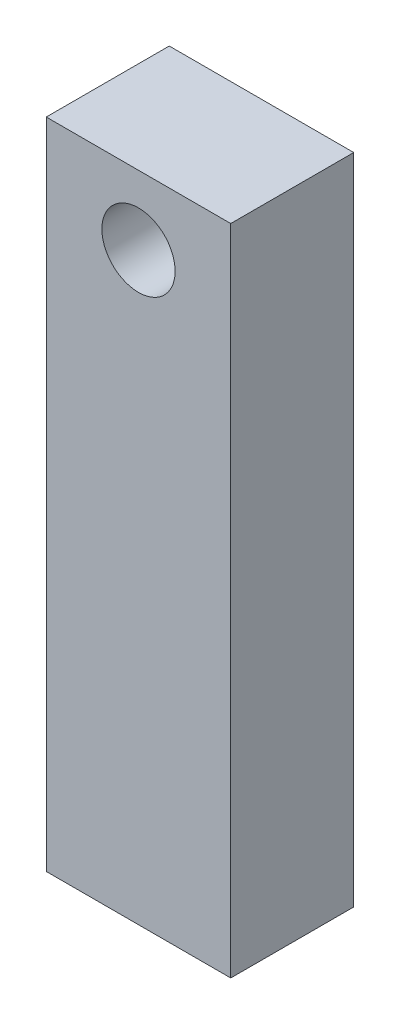
ISO-10303-21;
HEADER;
FILE_DESCRIPTION(('STEP AP214'),'2;1');
FILE_NAME('part.step','',(''),(''),'','','');
FILE_SCHEMA(('AUTOMOTIVE_DESIGN { 1 0 10303 214 1 1 1 1 }'));
ENDSEC;
DATA;
#1=APPLICATION_CONTEXT('core data for automotive mechanical design processes');
#2=APPLICATION_PROTOCOL_DEFINITION('international standard','automotive_design',2000,#1);
#3=PRODUCT_CONTEXT('',#1,'mechanical');
#4=PRODUCT('Part','Part','',(#3));
#5=PRODUCT_RELATED_PRODUCT_CATEGORY('part','',(#4));
#6=PRODUCT_DEFINITION_FORMATION('','',#4);
#7=PRODUCT_DEFINITION_CONTEXT('part definition',#1,'design');
#8=PRODUCT_DEFINITION('design','',#6,#7);
#9=PRODUCT_DEFINITION_SHAPE('','',#8);
#10=(LENGTH_UNIT() NAMED_UNIT(*) SI_UNIT(.MILLI.,.METRE.));
#11=(NAMED_UNIT(*) PLANE_ANGLE_UNIT() SI_UNIT($,.RADIAN.));
#12=(NAMED_UNIT(*) SI_UNIT($,.STERADIAN.) SOLID_ANGLE_UNIT());
#13=UNCERTAINTY_MEASURE_WITH_UNIT(LENGTH_MEASURE(1.E-05),#10,'distance_accuracy_value','');
#14=(GEOMETRIC_REPRESENTATION_CONTEXT(3) GLOBAL_UNCERTAINTY_ASSIGNED_CONTEXT((#13)) GLOBAL_UNIT_ASSIGNED_CONTEXT((#10,
#11,#12)) REPRESENTATION_CONTEXT('',''));
#15=CARTESIAN_POINT('',(0.,0.,0.));
#16=DIRECTION('',(0.,0.,1.));
#17=DIRECTION('',(1.,0.,0.));
#18=AXIS2_PLACEMENT_3D('',#15,#16,#17);
#19=CARTESIAN_POINT('',(-12.,85.,-8.));
#20=DIRECTION('',(1.,0.,0.));
#21=DIRECTION('',(0.,0.,-1.));
#22=AXIS2_PLACEMENT_3D('',#19,#20,#21);
#23=PLANE('',#22);
#24=DIRECTION('',(0.,0.,1.));
#25=VECTOR('',#24,1.);
#26=CARTESIAN_POINT('',(-12.,0.,-8.));
#27=LINE('',#26,#25);
#28=CARTESIAN_POINT('',(-12.,0.,-8.));
#29=VERTEX_POINT('',#28);
#30=CARTESIAN_POINT('',(-12.,0.,8.));
#31=VERTEX_POINT('',#30);
#32=EDGE_CURVE('E106',#29,#31,#27,.T.);
#33=ORIENTED_EDGE('',*,*,#32,.T.);
#34=DIRECTION('',(0.,-1.,0.));
#35=VECTOR('',#34,1.);
#36=CARTESIAN_POINT('',(-12.,85.,8.));
#37=LINE('',#36,#35);
#38=CARTESIAN_POINT('',(-12.,85.,8.));
#39=VERTEX_POINT('',#38);
#40=EDGE_CURVE('E11',#39,#31,#37,.T.);
#41=ORIENTED_EDGE('',*,*,#40,.F.);
#42=DIRECTION('',(0.,0.,1.));
#43=VECTOR('',#42,1.);
#44=CARTESIAN_POINT('',(-12.,85.,-8.));
#45=LINE('',#44,#43);
#46=CARTESIAN_POINT('',(-12.,85.,-8.));
#47=VERTEX_POINT('',#46);
#48=EDGE_CURVE('E91',#47,#39,#45,.T.);
#49=ORIENTED_EDGE('',*,*,#48,.F.);
#50=DIRECTION('',(0.,-1.,0.));
#51=VECTOR('',#50,1.);
#52=CARTESIAN_POINT('',(-12.,85.,-8.));
#53=LINE('',#52,#51);
#54=EDGE_CURVE('E105',#47,#29,#53,.T.);
#55=ORIENTED_EDGE('',*,*,#54,.T.);
#56=EDGE_LOOP('',(#33,#41,#49,#55));
#57=FACE_BOUND('',#56,.T.);
#58=ADVANCED_FACE('F41',(#57),#23,.F.);
#59=CARTESIAN_POINT('',(-12.,85.,8.));
#60=DIRECTION('',(0.,0.,-1.));
#61=DIRECTION('',(-1.,0.,0.));
#62=AXIS2_PLACEMENT_3D('',#59,#60,#61);
#63=PLANE('',#62);
#64=CARTESIAN_POINT('',(0.,76.,8.));
#65=DIRECTION('',(0.,0.,-1.));
#66=DIRECTION('',(-1.,0.,0.));
#67=AXIS2_PLACEMENT_3D('',#64,#65,#66);
#68=CIRCLE('',#67,4.7625);
#69=CARTESIAN_POINT('',(-4.7625,76.,8.));
#70=VERTEX_POINT('',#69);
#71=EDGE_CURVE('E108',#70,#70,#68,.T.);
#72=ORIENTED_EDGE('',*,*,#71,.T.);
#73=EDGE_LOOP('',(#72));
#74=FACE_BOUND('',#73,.T.);
#75=DIRECTION('',(1.,0.,0.));
#76=VECTOR('',#75,1.);
#77=CARTESIAN_POINT('',(-12.,0.,8.));
#78=LINE('',#77,#76);
#79=CARTESIAN_POINT('',(12.,0.,8.));
#80=VERTEX_POINT('',#79);
#81=EDGE_CURVE('E100',#31,#80,#78,.T.);
#82=ORIENTED_EDGE('',*,*,#81,.T.);
#83=DIRECTION('',(0.,-1.,0.));
#84=VECTOR('',#83,1.);
#85=CARTESIAN_POINT('',(12.,85.,8.));
#86=LINE('',#85,#84);
#87=CARTESIAN_POINT('',(12.,85.,8.));
#88=VERTEX_POINT('',#87);
#89=EDGE_CURVE('E49',#88,#80,#86,.T.);
#90=ORIENTED_EDGE('',*,*,#89,.F.);
#91=DIRECTION('',(1.,0.,0.));
#92=VECTOR('',#91,1.);
#93=CARTESIAN_POINT('',(-12.,85.,8.));
#94=LINE('',#93,#92);
#95=EDGE_CURVE('E86',#39,#88,#94,.T.);
#96=ORIENTED_EDGE('',*,*,#95,.F.);
#97=ORIENTED_EDGE('',*,*,#40,.T.);
#98=EDGE_LOOP('',(#82,#90,#96,#97));
#99=FACE_BOUND('',#98,.T.);
#100=ADVANCED_FACE('F96',(#74,#99),#63,.F.);
#101=CARTESIAN_POINT('',(12.,85.,8.));
#102=DIRECTION('',(-1.,0.,0.));
#103=DIRECTION('',(0.,0.,1.));
#104=AXIS2_PLACEMENT_3D('',#101,#102,#103);
#105=PLANE('',#104);
#106=DIRECTION('',(0.,0.,-1.));
#107=VECTOR('',#106,1.);
#108=CARTESIAN_POINT('',(12.,0.,8.));
#109=LINE('',#108,#107);
#110=CARTESIAN_POINT('',(12.,0.,-8.));
#111=VERTEX_POINT('',#110);
#112=EDGE_CURVE('E73',#80,#111,#109,.T.);
#113=ORIENTED_EDGE('',*,*,#112,.T.);
#114=DIRECTION('',(0.,-1.,0.));
#115=VECTOR('',#114,1.);
#116=CARTESIAN_POINT('',(12.,85.,-8.));
#117=LINE('',#116,#115);
#118=CARTESIAN_POINT('',(12.,85.,-8.));
#119=VERTEX_POINT('',#118);
#120=EDGE_CURVE('E98',#119,#111,#117,.T.);
#121=ORIENTED_EDGE('',*,*,#120,.F.);
#122=DIRECTION('',(0.,0.,-1.));
#123=VECTOR('',#122,1.);
#124=CARTESIAN_POINT('',(12.,85.,8.));
#125=LINE('',#124,#123);
#126=EDGE_CURVE('E93',#88,#119,#125,.T.);
#127=ORIENTED_EDGE('',*,*,#126,.F.);
#128=ORIENTED_EDGE('',*,*,#89,.T.);
#129=EDGE_LOOP('',(#113,#121,#127,#128));
#130=FACE_BOUND('',#129,.T.);
#131=ADVANCED_FACE('F99',(#130),#105,.F.);
#132=CARTESIAN_POINT('',(12.,85.,-8.));
#133=DIRECTION('',(0.,0.,1.));
#134=DIRECTION('',(1.,0.,0.));
#135=AXIS2_PLACEMENT_3D('',#132,#133,#134);
#136=PLANE('',#135);
#137=CARTESIAN_POINT('',(0.,76.,-8.));
#138=DIRECTION('',(0.,0.,1.));
#139=DIRECTION('',(1.,0.,0.));
#140=AXIS2_PLACEMENT_3D('',#137,#138,#139);
#141=CIRCLE('',#140,4.7625);
#142=CARTESIAN_POINT('',(4.7625,76.,-8.));
#143=VERTEX_POINT('',#142);
#144=EDGE_CURVE('E42',#143,#143,#141,.T.);
#145=ORIENTED_EDGE('',*,*,#144,.T.);
#146=EDGE_LOOP('',(#145));
#147=FACE_BOUND('',#146,.T.);
#148=DIRECTION('',(-1.,0.,0.));
#149=VECTOR('',#148,1.);
#150=CARTESIAN_POINT('',(12.,0.,-8.));
#151=LINE('',#150,#149);
#152=EDGE_CURVE('E81',#111,#29,#151,.T.);
#153=ORIENTED_EDGE('',*,*,#152,.T.);
#154=ORIENTED_EDGE('',*,*,#54,.F.);
#155=DIRECTION('',(-1.,0.,0.));
#156=VECTOR('',#155,1.);
#157=CARTESIAN_POINT('',(12.,85.,-8.));
#158=LINE('',#157,#156);
#159=EDGE_CURVE('E59',#119,#47,#158,.T.);
#160=ORIENTED_EDGE('',*,*,#159,.F.);
#161=ORIENTED_EDGE('',*,*,#120,.T.);
#162=EDGE_LOOP('',(#153,#154,#160,#161));
#163=FACE_BOUND('',#162,.T.);
#164=ADVANCED_FACE('F111',(#147,#163),#136,.F.);
#165=CARTESIAN_POINT('',(0.,85.,0.));
#166=DIRECTION('',(0.,1.,0.));
#167=DIRECTION('',(0.,0.,1.));
#168=AXIS2_PLACEMENT_3D('',#165,#166,#167);
#169=PLANE('',#168);
#170=ORIENTED_EDGE('',*,*,#48,.T.);
#171=ORIENTED_EDGE('',*,*,#95,.T.);
#172=ORIENTED_EDGE('',*,*,#126,.T.);
#173=ORIENTED_EDGE('',*,*,#159,.T.);
#174=EDGE_LOOP('',(#170,#171,#172,#173));
#175=FACE_BOUND('',#174,.T.);
#176=ADVANCED_FACE('F90',(#175),#169,.T.);
#177=CARTESIAN_POINT('',(0.,0.,0.));
#178=DIRECTION('',(0.,1.,0.));
#179=DIRECTION('',(0.,0.,1.));
#180=AXIS2_PLACEMENT_3D('',#177,#178,#179);
#181=PLANE('',#180);
#182=ORIENTED_EDGE('',*,*,#32,.F.);
#183=ORIENTED_EDGE('',*,*,#152,.F.);
#184=ORIENTED_EDGE('',*,*,#112,.F.);
#185=ORIENTED_EDGE('',*,*,#81,.F.);
#186=EDGE_LOOP('',(#182,#183,#184,#185));
#187=FACE_BOUND('',#186,.T.);
#188=ADVANCED_FACE('F119',(#187),#181,.F.);
#189=CARTESIAN_POINT('',(0.,76.,-10.));
#190=DIRECTION('',(0.,0.,1.));
#191=DIRECTION('',(1.,0.,0.));
#192=AXIS2_PLACEMENT_3D('',#189,#190,#191);
#193=CYLINDRICAL_SURFACE('',#192,4.7625);
#194=ORIENTED_EDGE('',*,*,#144,.F.);
#195=EDGE_LOOP('',(#194));
#196=FACE_BOUND('',#195,.T.);
#197=ORIENTED_EDGE('',*,*,#71,.F.);
#198=EDGE_LOOP('',(#197));
#199=FACE_BOUND('',#198,.T.);
#200=ADVANCED_FACE('F130',(#196,#199),#193,.F.);
#201=CLOSED_SHELL('',(#58,#100,#131,#164,#176,#188,#200));
#202=MANIFOLD_SOLID_BREP('B2',#201);
#203=ADVANCED_BREP_SHAPE_REPRESENTATION('',(#18,#202),#14);
#204=SHAPE_DEFINITION_REPRESENTATION(#9,#203);
ENDSEC;
END-ISO-10303-21;
